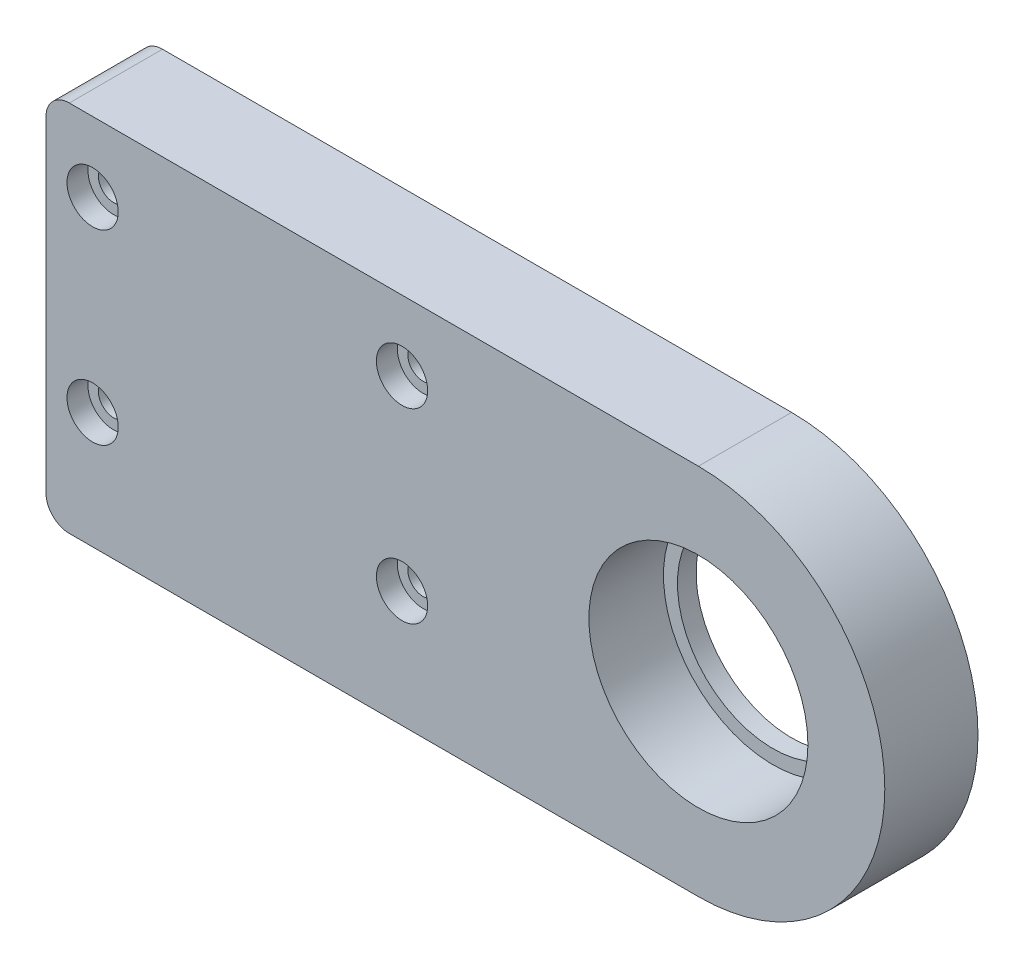
ISO-10303-21;
HEADER;
FILE_DESCRIPTION(('STEP AP214'),'2;1');
FILE_NAME('part.step','',(''),(''),'','','');
FILE_SCHEMA(('AUTOMOTIVE_DESIGN { 1 0 10303 214 1 1 1 1 }'));
ENDSEC;
DATA;
#1=APPLICATION_CONTEXT('core data for automotive mechanical design processes');
#2=APPLICATION_PROTOCOL_DEFINITION('international standard','automotive_design',2000,#1);
#3=PRODUCT_CONTEXT('',#1,'mechanical');
#4=PRODUCT('Part','Part','',(#3));
#5=PRODUCT_RELATED_PRODUCT_CATEGORY('part','',(#4));
#6=PRODUCT_DEFINITION_FORMATION('','',#4);
#7=PRODUCT_DEFINITION_CONTEXT('part definition',#1,'design');
#8=PRODUCT_DEFINITION('design','',#6,#7);
#9=PRODUCT_DEFINITION_SHAPE('','',#8);
#10=(LENGTH_UNIT() NAMED_UNIT(*) SI_UNIT(.MILLI.,.METRE.));
#11=(NAMED_UNIT(*) PLANE_ANGLE_UNIT() SI_UNIT($,.RADIAN.));
#12=(NAMED_UNIT(*) SI_UNIT($,.STERADIAN.) SOLID_ANGLE_UNIT());
#13=UNCERTAINTY_MEASURE_WITH_UNIT(LENGTH_MEASURE(1.E-05),#10,'distance_accuracy_value','');
#14=(GEOMETRIC_REPRESENTATION_CONTEXT(3) GLOBAL_UNCERTAINTY_ASSIGNED_CONTEXT((#13)) GLOBAL_UNIT_ASSIGNED_CONTEXT((#10,
#11,#12)) REPRESENTATION_CONTEXT('',''));
#15=CARTESIAN_POINT('',(0.,0.,0.));
#16=DIRECTION('',(0.,0.,1.));
#17=DIRECTION('',(1.,0.,0.));
#18=AXIS2_PLACEMENT_3D('',#15,#16,#17);
#19=CARTESIAN_POINT('',(-63.6,25.,-3.));
#20=DIRECTION('',(0.,0.,1.));
#21=DIRECTION('',(1.,0.,0.));
#22=AXIS2_PLACEMENT_3D('',#19,#20,#21);
#23=CYLINDRICAL_SURFACE('',#22,3.25000000000001);
#24=CARTESIAN_POINT('',(-63.6,25.,-3.));
#25=DIRECTION('',(0.,0.,1.));
#26=DIRECTION('',(1.,0.,0.));
#27=AXIS2_PLACEMENT_3D('',#24,#25,#26);
#28=CIRCLE('',#27,3.25000000000001);
#29=CARTESIAN_POINT('',(-60.35,25.,-3.));
#30=VERTEX_POINT('',#29);
#31=EDGE_CURVE('E589',#30,#30,#28,.T.);
#32=ORIENTED_EDGE('',*,*,#31,.F.);
#33=EDGE_LOOP('',(#32));
#34=FACE_BOUND('',#33,.T.);
#35=CARTESIAN_POINT('',(-63.6,25.,15.5));
#36=DIRECTION('',(0.,0.,1.));
#37=DIRECTION('',(1.,0.,0.));
#38=AXIS2_PLACEMENT_3D('',#35,#36,#37);
#39=CIRCLE('',#38,3.25000000000001);
#40=CARTESIAN_POINT('',(-60.35,25.,15.5));
#41=VERTEX_POINT('',#40);
#42=EDGE_CURVE('E246',#41,#41,#39,.F.);
#43=ORIENTED_EDGE('',*,*,#42,.F.);
#44=EDGE_LOOP('',(#43));
#45=FACE_BOUND('',#44,.T.);
#46=ADVANCED_FACE('F34',(#34,#45),#23,.F.);
#47=CARTESIAN_POINT('',(-130.,25.,-3.));
#48=DIRECTION('',(0.,0.,1.));
#49=DIRECTION('',(1.,0.,0.));
#50=AXIS2_PLACEMENT_3D('',#47,#48,#49);
#51=CYLINDRICAL_SURFACE('',#50,3.25000000000001);
#52=CARTESIAN_POINT('',(-130.,25.,-3.));
#53=DIRECTION('',(0.,0.,1.));
#54=DIRECTION('',(1.,0.,0.));
#55=AXIS2_PLACEMENT_3D('',#52,#53,#54);
#56=CIRCLE('',#55,3.25000000000001);
#57=CARTESIAN_POINT('',(-126.75,25.,-3.));
#58=VERTEX_POINT('',#57);
#59=EDGE_CURVE('E585',#58,#58,#56,.T.);
#60=ORIENTED_EDGE('',*,*,#59,.F.);
#61=EDGE_LOOP('',(#60));
#62=FACE_BOUND('',#61,.T.);
#63=CARTESIAN_POINT('',(-130.,25.,15.5));
#64=DIRECTION('',(0.,0.,1.));
#65=DIRECTION('',(1.,0.,0.));
#66=AXIS2_PLACEMENT_3D('',#63,#64,#65);
#67=CIRCLE('',#66,3.25000000000001);
#68=CARTESIAN_POINT('',(-126.75,25.,15.5));
#69=VERTEX_POINT('',#68);
#70=EDGE_CURVE('E243',#69,#69,#67,.F.);
#71=ORIENTED_EDGE('',*,*,#70,.F.);
#72=EDGE_LOOP('',(#71));
#73=FACE_BOUND('',#72,.T.);
#74=ADVANCED_FACE('F285',(#62,#73),#51,.F.);
#75=CARTESIAN_POINT('',(-130.,-15.,-3.));
#76=DIRECTION('',(0.,0.,1.));
#77=DIRECTION('',(1.,0.,0.));
#78=AXIS2_PLACEMENT_3D('',#75,#76,#77);
#79=CYLINDRICAL_SURFACE('',#78,3.25000000000001);
#80=CARTESIAN_POINT('',(-130.,-15.,-3.));
#81=DIRECTION('',(0.,0.,1.));
#82=DIRECTION('',(1.,0.,0.));
#83=AXIS2_PLACEMENT_3D('',#80,#81,#82);
#84=CIRCLE('',#83,3.25000000000001);
#85=CARTESIAN_POINT('',(-126.75,-15.,-3.));
#86=VERTEX_POINT('',#85);
#87=EDGE_CURVE('E582',#86,#86,#84,.T.);
#88=ORIENTED_EDGE('',*,*,#87,.F.);
#89=EDGE_LOOP('',(#88));
#90=FACE_BOUND('',#89,.T.);
#91=CARTESIAN_POINT('',(-130.,-15.,15.5));
#92=DIRECTION('',(0.,0.,1.));
#93=DIRECTION('',(1.,0.,0.));
#94=AXIS2_PLACEMENT_3D('',#91,#92,#93);
#95=CIRCLE('',#94,3.25000000000001);
#96=CARTESIAN_POINT('',(-126.75,-15.,15.5));
#97=VERTEX_POINT('',#96);
#98=EDGE_CURVE('E239',#97,#97,#95,.F.);
#99=ORIENTED_EDGE('',*,*,#98,.F.);
#100=EDGE_LOOP('',(#99));
#101=FACE_BOUND('',#100,.T.);
#102=ADVANCED_FACE('F291',(#90,#101),#79,.F.);
#103=CARTESIAN_POINT('',(-63.6,-15.,-3.));
#104=DIRECTION('',(0.,0.,1.));
#105=DIRECTION('',(1.,0.,0.));
#106=AXIS2_PLACEMENT_3D('',#103,#104,#105);
#107=CYLINDRICAL_SURFACE('',#106,3.25000000000001);
#108=CARTESIAN_POINT('',(-63.6,-15.,-3.));
#109=DIRECTION('',(0.,0.,1.));
#110=DIRECTION('',(1.,0.,0.));
#111=AXIS2_PLACEMENT_3D('',#108,#109,#110);
#112=CIRCLE('',#111,3.25000000000001);
#113=CARTESIAN_POINT('',(-60.35,-15.,-3.));
#114=VERTEX_POINT('',#113);
#115=EDGE_CURVE('E249',#114,#114,#112,.T.);
#116=ORIENTED_EDGE('',*,*,#115,.F.);
#117=EDGE_LOOP('',(#116));
#118=FACE_BOUND('',#117,.T.);
#119=CARTESIAN_POINT('',(-63.6,-15.,15.5));
#120=DIRECTION('',(0.,0.,1.));
#121=DIRECTION('',(1.,0.,0.));
#122=AXIS2_PLACEMENT_3D('',#119,#120,#121);
#123=CIRCLE('',#122,3.25000000000001);
#124=CARTESIAN_POINT('',(-60.35,-15.,15.5));
#125=VERTEX_POINT('',#124);
#126=EDGE_CURVE('E236',#125,#125,#123,.F.);
#127=ORIENTED_EDGE('',*,*,#126,.F.);
#128=EDGE_LOOP('',(#127));
#129=FACE_BOUND('',#128,.T.);
#130=ADVANCED_FACE('F298',(#118,#129),#107,.F.);
#131=CARTESIAN_POINT('',(0.,0.,0.));
#132=DIRECTION('',(0.,0.,1.));
#133=DIRECTION('',(1.,0.,0.));
#134=AXIS2_PLACEMENT_3D('',#131,#132,#133);
#135=PLANE('',#134);
#136=CARTESIAN_POINT('',(0.,0.,0.));
#137=DIRECTION('',(0.,0.,1.));
#138=DIRECTION('',(1.,0.,0.));
#139=AXIS2_PLACEMENT_3D('',#136,#137,#138);
#140=CIRCLE('',#139,20.5);
#141=CARTESIAN_POINT('',(20.5,0.,0.));
#142=VERTEX_POINT('',#141);
#143=EDGE_CURVE('E205',#142,#142,#140,.T.);
#144=ORIENTED_EDGE('',*,*,#143,.T.);
#145=EDGE_LOOP('',(#144));
#146=FACE_BOUND('',#145,.T.);
#147=DIRECTION('',(0.,-1.,0.));
#148=VECTOR('',#147,1.);
#149=CARTESIAN_POINT('',(-140.,40.,0.));
#150=LINE('',#149,#148);
#151=CARTESIAN_POINT('',(-140.,35.,0.));
#152=VERTEX_POINT('',#151);
#153=CARTESIAN_POINT('',(-140.,29.,0.));
#154=VERTEX_POINT('',#153);
#155=EDGE_CURVE('E162',#152,#154,#150,.T.);
#156=ORIENTED_EDGE('',*,*,#155,.F.);
#157=CARTESIAN_POINT('',(-135.,35.,0.));
#158=DIRECTION('',(0.,0.,1.));
#159=DIRECTION('',(1.,0.,0.));
#160=AXIS2_PLACEMENT_3D('',#157,#158,#159);
#161=CIRCLE('',#160,5.);
#162=CARTESIAN_POINT('',(-135.,40.,0.));
#163=VERTEX_POINT('',#162);
#164=EDGE_CURVE('E255',#152,#163,#161,.F.);
#165=ORIENTED_EDGE('',*,*,#164,.T.);
#166=DIRECTION('',(-1.,0.,0.));
#167=VECTOR('',#166,1.);
#168=CARTESIAN_POINT('',(0.,40.,0.));
#169=LINE('',#168,#167);
#170=CARTESIAN_POINT('',(0.,40.,0.));
#171=VERTEX_POINT('',#170);
#172=EDGE_CURVE('E222',#171,#163,#169,.T.);
#173=ORIENTED_EDGE('',*,*,#172,.F.);
#174=CARTESIAN_POINT('',(0.,0.,0.));
#175=DIRECTION('',(0.,0.,1.));
#176=DIRECTION('',(1.,0.,0.));
#177=AXIS2_PLACEMENT_3D('',#174,#175,#176);
#178=CIRCLE('',#177,40.);
#179=CARTESIAN_POINT('',(0.,-40.,0.));
#180=VERTEX_POINT('',#179);
#181=EDGE_CURVE('E208',#180,#171,#178,.T.);
#182=ORIENTED_EDGE('',*,*,#181,.F.);
#183=DIRECTION('',(1.,0.,0.));
#184=VECTOR('',#183,1.);
#185=CARTESIAN_POINT('',(-140.,-40.,0.));
#186=LINE('',#185,#184);
#187=CARTESIAN_POINT('',(-135.,-40.,0.));
#188=VERTEX_POINT('',#187);
#189=EDGE_CURVE('E213',#188,#180,#186,.T.);
#190=ORIENTED_EDGE('',*,*,#189,.F.);
#191=CARTESIAN_POINT('',(-135.,-35.,0.));
#192=DIRECTION('',(0.,0.,1.));
#193=DIRECTION('',(1.,0.,0.));
#194=AXIS2_PLACEMENT_3D('',#191,#192,#193);
#195=CIRCLE('',#194,5.);
#196=CARTESIAN_POINT('',(-140.,-35.,0.));
#197=VERTEX_POINT('',#196);
#198=EDGE_CURVE('E253',#188,#197,#195,.F.);
#199=ORIENTED_EDGE('',*,*,#198,.T.);
#200=CARTESIAN_POINT('',(-140.,-19.,0.));
#201=VERTEX_POINT('',#200);
#202=EDGE_CURVE('E224',#201,#197,#150,.T.);
#203=ORIENTED_EDGE('',*,*,#202,.F.);
#204=DIRECTION('',(-1.,0.,0.));
#205=VECTOR('',#204,1.);
#206=CARTESIAN_POINT('',(-140.,-19.,0.));
#207=LINE('',#206,#205);
#208=CARTESIAN_POINT('',(-55.,-19.,0.));
#209=VERTEX_POINT('',#208);
#210=EDGE_CURVE('E176',#209,#201,#207,.T.);
#211=ORIENTED_EDGE('',*,*,#210,.F.);
#212=DIRECTION('',(0.,-1.,0.));
#213=VECTOR('',#212,1.);
#214=CARTESIAN_POINT('',(-55.,-19.,0.));
#215=LINE('',#214,#213);
#216=CARTESIAN_POINT('',(-55.,-11.,0.));
#217=VERTEX_POINT('',#216);
#218=EDGE_CURVE('E166',#217,#209,#215,.T.);
#219=ORIENTED_EDGE('',*,*,#218,.F.);
#220=DIRECTION('',(1.,0.,0.));
#221=VECTOR('',#220,1.);
#222=CARTESIAN_POINT('',(-140.,-11.,0.));
#223=LINE('',#222,#221);
#224=CARTESIAN_POINT('',(-140.,-11.,0.));
#225=VERTEX_POINT('',#224);
#226=EDGE_CURVE('E163',#225,#217,#223,.T.);
#227=ORIENTED_EDGE('',*,*,#226,.F.);
#228=CARTESIAN_POINT('',(-140.,21.,0.));
#229=VERTEX_POINT('',#228);
#230=EDGE_CURVE('E226',#229,#225,#150,.T.);
#231=ORIENTED_EDGE('',*,*,#230,.F.);
#232=DIRECTION('',(-1.,0.,0.));
#233=VECTOR('',#232,1.);
#234=CARTESIAN_POINT('',(-140.,21.,0.));
#235=LINE('',#234,#233);
#236=CARTESIAN_POINT('',(-55.,21.,0.));
#237=VERTEX_POINT('',#236);
#238=EDGE_CURVE('E156',#237,#229,#235,.T.);
#239=ORIENTED_EDGE('',*,*,#238,.F.);
#240=DIRECTION('',(0.,-1.,0.));
#241=VECTOR('',#240,1.);
#242=CARTESIAN_POINT('',(-55.,21.,0.));
#243=LINE('',#242,#241);
#244=CARTESIAN_POINT('',(-55.,29.,0.));
#245=VERTEX_POINT('',#244);
#246=EDGE_CURVE('E597',#245,#237,#243,.T.);
#247=ORIENTED_EDGE('',*,*,#246,.F.);
#248=DIRECTION('',(1.,0.,0.));
#249=VECTOR('',#248,1.);
#250=CARTESIAN_POINT('',(-140.,29.,0.));
#251=LINE('',#250,#249);
#252=EDGE_CURVE('E591',#154,#245,#251,.T.);
#253=ORIENTED_EDGE('',*,*,#252,.F.);
#254=EDGE_LOOP('',(#156,#165,#173,#182,#190,#199,#203,#211,#219,#227,#231,#239,#247,#253));
#255=FACE_BOUND('',#254,.T.);
#256=ADVANCED_FACE('F266',(#146,#255),#135,.F.);
#257=CARTESIAN_POINT('',(0.,0.,20.));
#258=DIRECTION('',(0.,0.,-1.));
#259=DIRECTION('',(-1.,0.,0.));
#260=AXIS2_PLACEMENT_3D('',#257,#258,#259);
#261=CYLINDRICAL_SURFACE('',#260,20.5);
#262=ORIENTED_EDGE('',*,*,#143,.F.);
#263=EDGE_LOOP('',(#262));
#264=FACE_BOUND('',#263,.T.);
#265=CARTESIAN_POINT('',(0.,0.,4.));
#266=DIRECTION('',(0.,0.,1.));
#267=DIRECTION('',(1.,0.,0.));
#268=AXIS2_PLACEMENT_3D('',#265,#266,#267);
#269=CIRCLE('',#268,20.5);
#270=CARTESIAN_POINT('',(20.5,0.,4.));
#271=VERTEX_POINT('',#270);
#272=EDGE_CURVE('E202',#271,#271,#269,.T.);
#273=ORIENTED_EDGE('',*,*,#272,.T.);
#274=EDGE_LOOP('',(#273));
#275=FACE_BOUND('',#274,.T.);
#276=ADVANCED_FACE('F338',(#264,#275),#261,.F.);
#277=CARTESIAN_POINT('',(0.,0.,20.));
#278=DIRECTION('',(0.,0.,1.));
#279=DIRECTION('',(1.,0.,0.));
#280=AXIS2_PLACEMENT_3D('',#277,#278,#279);
#281=PLANE('',#280);
#282=CARTESIAN_POINT('',(-130.,-15.,20.));
#283=DIRECTION('',(0.,0.,1.));
#284=DIRECTION('',(1.,0.,0.));
#285=AXIS2_PLACEMENT_3D('',#282,#283,#284);
#286=CIRCLE('',#285,5.5);
#287=CARTESIAN_POINT('',(-124.5,-15.,20.));
#288=VERTEX_POINT('',#287);
#289=EDGE_CURVE('E625',#288,#288,#286,.T.);
#290=ORIENTED_EDGE('',*,*,#289,.F.);
#291=EDGE_LOOP('',(#290));
#292=FACE_BOUND('',#291,.T.);
#293=CARTESIAN_POINT('',(-63.6,-15.,20.));
#294=DIRECTION('',(0.,0.,1.));
#295=DIRECTION('',(1.,0.,0.));
#296=AXIS2_PLACEMENT_3D('',#293,#294,#295);
#297=CIRCLE('',#296,5.49999999999999);
#298=CARTESIAN_POINT('',(-58.1,-15.,20.));
#299=VERTEX_POINT('',#298);
#300=EDGE_CURVE('E631',#299,#299,#297,.T.);
#301=ORIENTED_EDGE('',*,*,#300,.F.);
#302=EDGE_LOOP('',(#301));
#303=FACE_BOUND('',#302,.T.);
#304=CARTESIAN_POINT('',(-63.6,25.,20.));
#305=DIRECTION('',(0.,0.,1.));
#306=DIRECTION('',(1.,0.,0.));
#307=AXIS2_PLACEMENT_3D('',#304,#305,#306);
#308=CIRCLE('',#307,5.49999999999999);
#309=CARTESIAN_POINT('',(-58.1,25.,20.));
#310=VERTEX_POINT('',#309);
#311=EDGE_CURVE('E637',#310,#310,#308,.T.);
#312=ORIENTED_EDGE('',*,*,#311,.F.);
#313=EDGE_LOOP('',(#312));
#314=FACE_BOUND('',#313,.T.);
#315=CARTESIAN_POINT('',(-130.,25.,20.));
#316=DIRECTION('',(0.,0.,1.));
#317=DIRECTION('',(1.,0.,0.));
#318=AXIS2_PLACEMENT_3D('',#315,#316,#317);
#319=CIRCLE('',#318,5.5);
#320=CARTESIAN_POINT('',(-124.5,25.,20.));
#321=VERTEX_POINT('',#320);
#322=EDGE_CURVE('E619',#321,#321,#319,.T.);
#323=ORIENTED_EDGE('',*,*,#322,.F.);
#324=EDGE_LOOP('',(#323));
#325=FACE_BOUND('',#324,.T.);
#326=CARTESIAN_POINT('',(0.,0.,20.));
#327=DIRECTION('',(0.,0.,1.));
#328=DIRECTION('',(1.,0.,0.));
#329=AXIS2_PLACEMENT_3D('',#326,#327,#328);
#330=CIRCLE('',#329,23.5);
#331=CARTESIAN_POINT('',(23.5,0.,20.));
#332=VERTEX_POINT('',#331);
#333=EDGE_CURVE('E198',#332,#332,#330,.T.);
#334=ORIENTED_EDGE('',*,*,#333,.F.);
#335=EDGE_LOOP('',(#334));
#336=FACE_BOUND('',#335,.T.);
#337=DIRECTION('',(-1.,0.,0.));
#338=VECTOR('',#337,1.);
#339=CARTESIAN_POINT('',(0.,40.,20.));
#340=LINE('',#339,#338);
#341=CARTESIAN_POINT('',(0.,40.,20.));
#342=VERTEX_POINT('',#341);
#343=CARTESIAN_POINT('',(-135.,40.,20.));
#344=VERTEX_POINT('',#343);
#345=EDGE_CURVE('E212',#342,#344,#340,.T.);
#346=ORIENTED_EDGE('',*,*,#345,.T.);
#347=CARTESIAN_POINT('',(-135.,35.,20.));
#348=DIRECTION('',(0.,0.,1.));
#349=DIRECTION('',(1.,0.,0.));
#350=AXIS2_PLACEMENT_3D('',#347,#348,#349);
#351=CIRCLE('',#350,5.);
#352=CARTESIAN_POINT('',(-140.,35.,20.));
#353=VERTEX_POINT('',#352);
#354=EDGE_CURVE('E42',#344,#353,#351,.T.);
#355=ORIENTED_EDGE('',*,*,#354,.T.);
#356=DIRECTION('',(0.,-1.,0.));
#357=VECTOR('',#356,1.);
#358=CARTESIAN_POINT('',(-140.,40.,20.));
#359=LINE('',#358,#357);
#360=CARTESIAN_POINT('',(-140.,-35.,20.));
#361=VERTEX_POINT('',#360);
#362=EDGE_CURVE('E215',#353,#361,#359,.T.);
#363=ORIENTED_EDGE('',*,*,#362,.T.);
#364=CARTESIAN_POINT('',(-135.,-35.,20.));
#365=DIRECTION('',(0.,0.,1.));
#366=DIRECTION('',(1.,0.,0.));
#367=AXIS2_PLACEMENT_3D('',#364,#365,#366);
#368=CIRCLE('',#367,5.);
#369=CARTESIAN_POINT('',(-135.,-40.,20.));
#370=VERTEX_POINT('',#369);
#371=EDGE_CURVE('E49',#361,#370,#368,.T.);
#372=ORIENTED_EDGE('',*,*,#371,.T.);
#373=DIRECTION('',(1.,0.,0.));
#374=VECTOR('',#373,1.);
#375=CARTESIAN_POINT('',(-140.,-40.,20.));
#376=LINE('',#375,#374);
#377=CARTESIAN_POINT('',(0.,-40.,20.));
#378=VERTEX_POINT('',#377);
#379=EDGE_CURVE('E217',#370,#378,#376,.T.);
#380=ORIENTED_EDGE('',*,*,#379,.T.);
#381=CARTESIAN_POINT('',(0.,0.,20.));
#382=DIRECTION('',(0.,0.,1.));
#383=DIRECTION('',(1.,0.,0.));
#384=AXIS2_PLACEMENT_3D('',#381,#382,#383);
#385=CIRCLE('',#384,40.);
#386=EDGE_CURVE('E209',#378,#342,#385,.T.);
#387=ORIENTED_EDGE('',*,*,#386,.T.);
#388=EDGE_LOOP('',(#346,#355,#363,#372,#380,#387));
#389=FACE_BOUND('',#388,.T.);
#390=ADVANCED_FACE('F259',(#292,#303,#314,#325,#336,#389),#281,.T.);
#391=CARTESIAN_POINT('',(0.,0.,20.));
#392=DIRECTION('',(0.,0.,-1.));
#393=DIRECTION('',(-1.,0.,0.));
#394=AXIS2_PLACEMENT_3D('',#391,#392,#393);
#395=CYLINDRICAL_SURFACE('',#394,40.);
#396=ORIENTED_EDGE('',*,*,#181,.T.);
#397=DIRECTION('',(0.,0.,-1.));
#398=VECTOR('',#397,1.);
#399=CARTESIAN_POINT('',(0.,40.,20.));
#400=LINE('',#399,#398);
#401=EDGE_CURVE('E230',#342,#171,#400,.T.);
#402=ORIENTED_EDGE('',*,*,#401,.F.);
#403=ORIENTED_EDGE('',*,*,#386,.F.);
#404=DIRECTION('',(0.,0.,-1.));
#405=VECTOR('',#404,1.);
#406=CARTESIAN_POINT('',(0.,-40.,20.));
#407=LINE('',#406,#405);
#408=EDGE_CURVE('E219',#378,#180,#407,.T.);
#409=ORIENTED_EDGE('',*,*,#408,.T.);
#410=EDGE_LOOP('',(#396,#402,#403,#409));
#411=FACE_BOUND('',#410,.T.);
#412=ADVANCED_FACE('F272',(#411),#395,.T.);
#413=CARTESIAN_POINT('',(0.,40.,20.));
#414=DIRECTION('',(0.,-1.,0.));
#415=DIRECTION('',(0.,0.,-1.));
#416=AXIS2_PLACEMENT_3D('',#413,#414,#415);
#417=PLANE('',#416);
#418=ORIENTED_EDGE('',*,*,#172,.T.);
#419=DIRECTION('',(0.,0.,-1.));
#420=VECTOR('',#419,1.);
#421=CARTESIAN_POINT('',(-135.,40.,20.));
#422=LINE('',#421,#420);
#423=EDGE_CURVE('E57',#163,#344,#422,.F.);
#424=ORIENTED_EDGE('',*,*,#423,.T.);
#425=ORIENTED_EDGE('',*,*,#345,.F.);
#426=ORIENTED_EDGE('',*,*,#401,.T.);
#427=EDGE_LOOP('',(#418,#424,#425,#426));
#428=FACE_BOUND('',#427,.T.);
#429=ADVANCED_FACE('F268',(#428),#417,.F.);
#430=CARTESIAN_POINT('',(-140.,40.,20.));
#431=DIRECTION('',(1.,0.,0.));
#432=DIRECTION('',(0.,0.,-1.));
#433=AXIS2_PLACEMENT_3D('',#430,#431,#432);
#434=PLANE('',#433);
#435=ORIENTED_EDGE('',*,*,#362,.F.);
#436=DIRECTION('',(0.,0.,-1.));
#437=VECTOR('',#436,1.);
#438=CARTESIAN_POINT('',(-140.,35.,20.));
#439=LINE('',#438,#437);
#440=EDGE_CURVE('E251',#353,#152,#439,.T.);
#441=ORIENTED_EDGE('',*,*,#440,.T.);
#442=ORIENTED_EDGE('',*,*,#155,.T.);
#443=DIRECTION('',(0.,0.,1.));
#444=VECTOR('',#443,1.);
#445=CARTESIAN_POINT('',(-140.,29.,-3.));
#446=LINE('',#445,#444);
#447=CARTESIAN_POINT('',(-140.,29.,-3.));
#448=VERTEX_POINT('',#447);
#449=EDGE_CURVE('E141',#448,#154,#446,.T.);
#450=ORIENTED_EDGE('',*,*,#449,.F.);
#451=DIRECTION('',(0.,1.,0.));
#452=VECTOR('',#451,1.);
#453=CARTESIAN_POINT('',(-140.,21.,-3.));
#454=LINE('',#453,#452);
#455=CARTESIAN_POINT('',(-140.,21.,-3.));
#456=VERTEX_POINT('',#455);
#457=EDGE_CURVE('E148',#456,#448,#454,.T.);
#458=ORIENTED_EDGE('',*,*,#457,.F.);
#459=DIRECTION('',(0.,0.,1.));
#460=VECTOR('',#459,1.);
#461=CARTESIAN_POINT('',(-140.,21.,-3.));
#462=LINE('',#461,#460);
#463=EDGE_CURVE('E595',#456,#229,#462,.T.);
#464=ORIENTED_EDGE('',*,*,#463,.T.);
#465=ORIENTED_EDGE('',*,*,#230,.T.);
#466=DIRECTION('',(0.,0.,1.));
#467=VECTOR('',#466,1.);
#468=CARTESIAN_POINT('',(-140.,-11.,-3.));
#469=LINE('',#468,#467);
#470=CARTESIAN_POINT('',(-140.,-11.,-3.));
#471=VERTEX_POINT('',#470);
#472=EDGE_CURVE('E195',#471,#225,#469,.T.);
#473=ORIENTED_EDGE('',*,*,#472,.F.);
#474=DIRECTION('',(0.,1.,0.));
#475=VECTOR('',#474,1.);
#476=CARTESIAN_POINT('',(-140.,-19.,-3.));
#477=LINE('',#476,#475);
#478=CARTESIAN_POINT('',(-140.,-19.,-3.));
#479=VERTEX_POINT('',#478);
#480=EDGE_CURVE('E172',#479,#471,#477,.T.);
#481=ORIENTED_EDGE('',*,*,#480,.F.);
#482=DIRECTION('',(0.,0.,1.));
#483=VECTOR('',#482,1.);
#484=CARTESIAN_POINT('',(-140.,-19.,-3.));
#485=LINE('',#484,#483);
#486=EDGE_CURVE('E181',#479,#201,#485,.T.);
#487=ORIENTED_EDGE('',*,*,#486,.T.);
#488=ORIENTED_EDGE('',*,*,#202,.T.);
#489=DIRECTION('',(0.,0.,-1.));
#490=VECTOR('',#489,1.);
#491=CARTESIAN_POINT('',(-140.,-35.,20.));
#492=LINE('',#491,#490);
#493=EDGE_CURVE('E233',#197,#361,#492,.F.);
#494=ORIENTED_EDGE('',*,*,#493,.T.);
#495=EDGE_LOOP('',(#435,#441,#442,#450,#458,#464,#465,#473,#481,#487,#488,#494));
#496=FACE_BOUND('',#495,.T.);
#497=ADVANCED_FACE('F159',(#496),#434,.F.);
#498=CARTESIAN_POINT('',(-140.,-40.,20.));
#499=DIRECTION('',(0.,1.,0.));
#500=DIRECTION('',(0.,0.,1.));
#501=AXIS2_PLACEMENT_3D('',#498,#499,#500);
#502=PLANE('',#501);
#503=ORIENTED_EDGE('',*,*,#379,.F.);
#504=DIRECTION('',(0.,0.,-1.));
#505=VECTOR('',#504,1.);
#506=CARTESIAN_POINT('',(-135.,-40.,20.));
#507=LINE('',#506,#505);
#508=EDGE_CURVE('E11',#370,#188,#507,.T.);
#509=ORIENTED_EDGE('',*,*,#508,.T.);
#510=ORIENTED_EDGE('',*,*,#189,.T.);
#511=ORIENTED_EDGE('',*,*,#408,.F.);
#512=EDGE_LOOP('',(#503,#509,#510,#511));
#513=FACE_BOUND('',#512,.T.);
#514=ADVANCED_FACE('F276',(#513),#502,.F.);
#515=CARTESIAN_POINT('',(0.,0.,4.));
#516=DIRECTION('',(0.,0.,1.));
#517=DIRECTION('',(1.,0.,0.));
#518=AXIS2_PLACEMENT_3D('',#515,#516,#517);
#519=CYLINDRICAL_SURFACE('',#518,23.5);
#520=CARTESIAN_POINT('',(0.,0.,4.));
#521=DIRECTION('',(0.,0.,1.));
#522=DIRECTION('',(1.,0.,0.));
#523=AXIS2_PLACEMENT_3D('',#520,#521,#522);
#524=CIRCLE('',#523,23.5);
#525=CARTESIAN_POINT('',(23.5,0.,4.));
#526=VERTEX_POINT('',#525);
#527=EDGE_CURVE('E199',#526,#526,#524,.T.);
#528=ORIENTED_EDGE('',*,*,#527,.F.);
#529=EDGE_LOOP('',(#528));
#530=FACE_BOUND('',#529,.T.);
#531=ORIENTED_EDGE('',*,*,#333,.T.);
#532=EDGE_LOOP('',(#531));
#533=FACE_BOUND('',#532,.T.);
#534=ADVANCED_FACE('F333',(#530,#533),#519,.F.);
#535=CARTESIAN_POINT('',(0.,0.,4.));
#536=DIRECTION('',(0.,0.,1.));
#537=DIRECTION('',(1.,0.,0.));
#538=AXIS2_PLACEMENT_3D('',#535,#536,#537);
#539=PLANE('',#538);
#540=ORIENTED_EDGE('',*,*,#272,.F.);
#541=EDGE_LOOP('',(#540));
#542=FACE_BOUND('',#541,.T.);
#543=ORIENTED_EDGE('',*,*,#527,.T.);
#544=EDGE_LOOP('',(#543));
#545=FACE_BOUND('',#544,.T.);
#546=ADVANCED_FACE('F329',(#542,#545),#539,.T.);
#547=CARTESIAN_POINT('',(-140.,-11.,-3.));
#548=DIRECTION('',(0.,-1.,0.));
#549=DIRECTION('',(0.,0.,-1.));
#550=AXIS2_PLACEMENT_3D('',#547,#548,#549);
#551=PLANE('',#550);
#552=ORIENTED_EDGE('',*,*,#226,.T.);
#553=DIRECTION('',(0.,0.,1.));
#554=VECTOR('',#553,1.);
#555=CARTESIAN_POINT('',(-55.,-11.,-3.));
#556=LINE('',#555,#554);
#557=CARTESIAN_POINT('',(-55.,-11.,-3.));
#558=VERTEX_POINT('',#557);
#559=EDGE_CURVE('E192',#558,#217,#556,.T.);
#560=ORIENTED_EDGE('',*,*,#559,.F.);
#561=DIRECTION('',(1.,0.,0.));
#562=VECTOR('',#561,1.);
#563=CARTESIAN_POINT('',(-140.,-11.,-3.));
#564=LINE('',#563,#562);
#565=EDGE_CURVE('E175',#471,#558,#564,.T.);
#566=ORIENTED_EDGE('',*,*,#565,.F.);
#567=ORIENTED_EDGE('',*,*,#472,.T.);
#568=EDGE_LOOP('',(#552,#560,#566,#567));
#569=FACE_BOUND('',#568,.T.);
#570=ADVANCED_FACE('F325',(#569),#551,.F.);
#571=CARTESIAN_POINT('',(-55.,-19.,-3.));
#572=DIRECTION('',(-1.,0.,0.));
#573=DIRECTION('',(0.,0.,1.));
#574=AXIS2_PLACEMENT_3D('',#571,#572,#573);
#575=PLANE('',#574);
#576=ORIENTED_EDGE('',*,*,#218,.T.);
#577=DIRECTION('',(0.,0.,1.));
#578=VECTOR('',#577,1.);
#579=CARTESIAN_POINT('',(-55.,-19.,-3.));
#580=LINE('',#579,#578);
#581=CARTESIAN_POINT('',(-55.,-19.,-3.));
#582=VERTEX_POINT('',#581);
#583=EDGE_CURVE('E189',#582,#209,#580,.T.);
#584=ORIENTED_EDGE('',*,*,#583,.F.);
#585=DIRECTION('',(0.,-1.,0.));
#586=VECTOR('',#585,1.);
#587=CARTESIAN_POINT('',(-55.,-19.,-3.));
#588=LINE('',#587,#586);
#589=EDGE_CURVE('E178',#558,#582,#588,.T.);
#590=ORIENTED_EDGE('',*,*,#589,.F.);
#591=ORIENTED_EDGE('',*,*,#559,.T.);
#592=EDGE_LOOP('',(#576,#584,#590,#591));
#593=FACE_BOUND('',#592,.T.);
#594=ADVANCED_FACE('F321',(#593),#575,.F.);
#595=CARTESIAN_POINT('',(-140.,-19.,-3.));
#596=DIRECTION('',(0.,1.,0.));
#597=DIRECTION('',(-1.,0.,0.));
#598=AXIS2_PLACEMENT_3D('',#595,#596,#597);
#599=PLANE('',#598);
#600=ORIENTED_EDGE('',*,*,#210,.T.);
#601=ORIENTED_EDGE('',*,*,#486,.F.);
#602=DIRECTION('',(-1.,0.,0.));
#603=VECTOR('',#602,1.);
#604=CARTESIAN_POINT('',(-140.,-19.,-3.));
#605=LINE('',#604,#603);
#606=EDGE_CURVE('E180',#582,#479,#605,.T.);
#607=ORIENTED_EDGE('',*,*,#606,.F.);
#608=ORIENTED_EDGE('',*,*,#583,.T.);
#609=EDGE_LOOP('',(#600,#601,#607,#608));
#610=FACE_BOUND('',#609,.T.);
#611=ADVANCED_FACE('F317',(#610),#599,.F.);
#612=CARTESIAN_POINT('',(0.,0.,-3.));
#613=DIRECTION('',(0.,0.,-1.));
#614=DIRECTION('',(-1.,0.,0.));
#615=AXIS2_PLACEMENT_3D('',#612,#613,#614);
#616=PLANE('',#615);
#617=ORIENTED_EDGE('',*,*,#115,.T.);
#618=EDGE_LOOP('',(#617));
#619=FACE_BOUND('',#618,.T.);
#620=ORIENTED_EDGE('',*,*,#87,.T.);
#621=EDGE_LOOP('',(#620));
#622=FACE_BOUND('',#621,.T.);
#623=ORIENTED_EDGE('',*,*,#480,.T.);
#624=ORIENTED_EDGE('',*,*,#565,.T.);
#625=ORIENTED_EDGE('',*,*,#589,.T.);
#626=ORIENTED_EDGE('',*,*,#606,.T.);
#627=EDGE_LOOP('',(#623,#624,#625,#626));
#628=FACE_BOUND('',#627,.T.);
#629=ADVANCED_FACE('F314',(#619,#622,#628),#616,.T.);
#630=CARTESIAN_POINT('',(-140.,29.,-3.));
#631=DIRECTION('',(0.,-1.,0.));
#632=DIRECTION('',(1.,0.,0.));
#633=AXIS2_PLACEMENT_3D('',#630,#631,#632);
#634=PLANE('',#633);
#635=ORIENTED_EDGE('',*,*,#252,.T.);
#636=DIRECTION('',(0.,0.,1.));
#637=VECTOR('',#636,1.);
#638=CARTESIAN_POINT('',(-55.,29.,-3.));
#639=LINE('',#638,#637);
#640=CARTESIAN_POINT('',(-55.,29.,-3.));
#641=VERTEX_POINT('',#640);
#642=EDGE_CURVE('E144',#641,#245,#639,.T.);
#643=ORIENTED_EDGE('',*,*,#642,.F.);
#644=DIRECTION('',(1.,0.,0.));
#645=VECTOR('',#644,1.);
#646=CARTESIAN_POINT('',(-140.,29.,-3.));
#647=LINE('',#646,#645);
#648=EDGE_CURVE('E137',#448,#641,#647,.T.);
#649=ORIENTED_EDGE('',*,*,#648,.F.);
#650=ORIENTED_EDGE('',*,*,#449,.T.);
#651=EDGE_LOOP('',(#635,#643,#649,#650));
#652=FACE_BOUND('',#651,.T.);
#653=ADVANCED_FACE('F139',(#652),#634,.F.);
#654=CARTESIAN_POINT('',(-55.,21.,-3.));
#655=DIRECTION('',(-1.,0.,0.));
#656=DIRECTION('',(0.,0.,1.));
#657=AXIS2_PLACEMENT_3D('',#654,#655,#656);
#658=PLANE('',#657);
#659=ORIENTED_EDGE('',*,*,#246,.T.);
#660=DIRECTION('',(0.,0.,1.));
#661=VECTOR('',#660,1.);
#662=CARTESIAN_POINT('',(-55.,21.,-3.));
#663=LINE('',#662,#661);
#664=CARTESIAN_POINT('',(-55.,21.,-3.));
#665=VERTEX_POINT('',#664);
#666=EDGE_CURVE('E168',#665,#237,#663,.T.);
#667=ORIENTED_EDGE('',*,*,#666,.F.);
#668=DIRECTION('',(0.,-1.,0.));
#669=VECTOR('',#668,1.);
#670=CARTESIAN_POINT('',(-55.,21.,-3.));
#671=LINE('',#670,#669);
#672=EDGE_CURVE('E147',#641,#665,#671,.T.);
#673=ORIENTED_EDGE('',*,*,#672,.F.);
#674=ORIENTED_EDGE('',*,*,#642,.T.);
#675=EDGE_LOOP('',(#659,#667,#673,#674));
#676=FACE_BOUND('',#675,.T.);
#677=ADVANCED_FACE('F307',(#676),#658,.F.);
#678=CARTESIAN_POINT('',(-140.,21.,-3.));
#679=DIRECTION('',(0.,1.,0.));
#680=DIRECTION('',(-1.,0.,0.));
#681=AXIS2_PLACEMENT_3D('',#678,#679,#680);
#682=PLANE('',#681);
#683=ORIENTED_EDGE('',*,*,#238,.T.);
#684=ORIENTED_EDGE('',*,*,#463,.F.);
#685=DIRECTION('',(-1.,0.,0.));
#686=VECTOR('',#685,1.);
#687=CARTESIAN_POINT('',(-140.,21.,-3.));
#688=LINE('',#687,#686);
#689=EDGE_CURVE('E153',#665,#456,#688,.T.);
#690=ORIENTED_EDGE('',*,*,#689,.F.);
#691=ORIENTED_EDGE('',*,*,#666,.T.);
#692=EDGE_LOOP('',(#683,#684,#690,#691));
#693=FACE_BOUND('',#692,.T.);
#694=ADVANCED_FACE('F303',(#693),#682,.F.);
#695=CARTESIAN_POINT('',(0.,0.,-3.));
#696=DIRECTION('',(0.,0.,-1.));
#697=DIRECTION('',(-1.,0.,0.));
#698=AXIS2_PLACEMENT_3D('',#695,#696,#697);
#699=PLANE('',#698);
#700=ORIENTED_EDGE('',*,*,#59,.T.);
#701=EDGE_LOOP('',(#700));
#702=FACE_BOUND('',#701,.T.);
#703=ORIENTED_EDGE('',*,*,#31,.T.);
#704=EDGE_LOOP('',(#703));
#705=FACE_BOUND('',#704,.T.);
#706=ORIENTED_EDGE('',*,*,#457,.T.);
#707=ORIENTED_EDGE('',*,*,#648,.T.);
#708=ORIENTED_EDGE('',*,*,#672,.T.);
#709=ORIENTED_EDGE('',*,*,#689,.T.);
#710=EDGE_LOOP('',(#706,#707,#708,#709));
#711=FACE_BOUND('',#710,.T.);
#712=ADVANCED_FACE('F151',(#702,#705,#711),#699,.T.);
#713=CARTESIAN_POINT('',(-63.6,-15.,15.5));
#714=DIRECTION('',(0.,0.,1.));
#715=DIRECTION('',(1.,0.,0.));
#716=AXIS2_PLACEMENT_3D('',#713,#714,#715);
#717=PLANE('',#716);
#718=CARTESIAN_POINT('',(-63.6,-15.,15.5));
#719=DIRECTION('',(0.,0.,1.));
#720=DIRECTION('',(1.,0.,0.));
#721=AXIS2_PLACEMENT_3D('',#718,#719,#720);
#722=CIRCLE('',#721,5.49999999999999);
#723=CARTESIAN_POINT('',(-58.1,-15.,15.5));
#724=VERTEX_POINT('',#723);
#725=EDGE_CURVE('E634',#724,#724,#722,.T.);
#726=ORIENTED_EDGE('',*,*,#725,.T.);
#727=EDGE_LOOP('',(#726));
#728=FACE_BOUND('',#727,.T.);
#729=ORIENTED_EDGE('',*,*,#126,.T.);
#730=EDGE_LOOP('',(#729));
#731=FACE_BOUND('',#730,.T.);
#732=ADVANCED_FACE('F302',(#728,#731),#717,.T.);
#733=CARTESIAN_POINT('',(-63.6,-15.,15.5));
#734=DIRECTION('',(0.,0.,1.));
#735=DIRECTION('',(1.,0.,0.));
#736=AXIS2_PLACEMENT_3D('',#733,#734,#735);
#737=CYLINDRICAL_SURFACE('',#736,5.49999999999999);
#738=ORIENTED_EDGE('',*,*,#725,.F.);
#739=EDGE_LOOP('',(#738));
#740=FACE_BOUND('',#739,.T.);
#741=ORIENTED_EDGE('',*,*,#300,.T.);
#742=EDGE_LOOP('',(#741));
#743=FACE_BOUND('',#742,.T.);
#744=ADVANCED_FACE('F419',(#740,#743),#737,.F.);
#745=CARTESIAN_POINT('',(-130.,-15.,15.5));
#746=DIRECTION('',(0.,0.,1.));
#747=DIRECTION('',(1.,0.,0.));
#748=AXIS2_PLACEMENT_3D('',#745,#746,#747);
#749=PLANE('',#748);
#750=CARTESIAN_POINT('',(-130.,-15.,15.5));
#751=DIRECTION('',(0.,0.,1.));
#752=DIRECTION('',(1.,0.,0.));
#753=AXIS2_PLACEMENT_3D('',#750,#751,#752);
#754=CIRCLE('',#753,5.5);
#755=CARTESIAN_POINT('',(-124.5,-15.,15.5));
#756=VERTEX_POINT('',#755);
#757=EDGE_CURVE('E628',#756,#756,#754,.T.);
#758=ORIENTED_EDGE('',*,*,#757,.T.);
#759=EDGE_LOOP('',(#758));
#760=FACE_BOUND('',#759,.T.);
#761=ORIENTED_EDGE('',*,*,#98,.T.);
#762=EDGE_LOOP('',(#761));
#763=FACE_BOUND('',#762,.T.);
#764=ADVANCED_FACE('F428',(#760,#763),#749,.T.);
#765=CARTESIAN_POINT('',(-130.,-15.,15.5));
#766=DIRECTION('',(0.,0.,1.));
#767=DIRECTION('',(1.,0.,0.));
#768=AXIS2_PLACEMENT_3D('',#765,#766,#767);
#769=CYLINDRICAL_SURFACE('',#768,5.5);
#770=ORIENTED_EDGE('',*,*,#757,.F.);
#771=EDGE_LOOP('',(#770));
#772=FACE_BOUND('',#771,.T.);
#773=ORIENTED_EDGE('',*,*,#289,.T.);
#774=EDGE_LOOP('',(#773));
#775=FACE_BOUND('',#774,.T.);
#776=ADVANCED_FACE('F436',(#772,#775),#769,.F.);
#777=CARTESIAN_POINT('',(-130.,25.,15.5));
#778=DIRECTION('',(0.,0.,1.));
#779=DIRECTION('',(1.,0.,0.));
#780=AXIS2_PLACEMENT_3D('',#777,#778,#779);
#781=PLANE('',#780);
#782=CARTESIAN_POINT('',(-130.,25.,15.5));
#783=DIRECTION('',(0.,0.,1.));
#784=DIRECTION('',(1.,0.,0.));
#785=AXIS2_PLACEMENT_3D('',#782,#783,#784);
#786=CIRCLE('',#785,5.5);
#787=CARTESIAN_POINT('',(-124.5,25.,15.5));
#788=VERTEX_POINT('',#787);
#789=EDGE_CURVE('E240',#788,#788,#786,.T.);
#790=ORIENTED_EDGE('',*,*,#789,.T.);
#791=EDGE_LOOP('',(#790));
#792=FACE_BOUND('',#791,.T.);
#793=ORIENTED_EDGE('',*,*,#70,.T.);
#794=EDGE_LOOP('',(#793));
#795=FACE_BOUND('',#794,.T.);
#796=ADVANCED_FACE('F444',(#792,#795),#781,.T.);
#797=CARTESIAN_POINT('',(-130.,25.,15.5));
#798=DIRECTION('',(0.,0.,1.));
#799=DIRECTION('',(1.,0.,0.));
#800=AXIS2_PLACEMENT_3D('',#797,#798,#799);
#801=CYLINDRICAL_SURFACE('',#800,5.5);
#802=ORIENTED_EDGE('',*,*,#789,.F.);
#803=EDGE_LOOP('',(#802));
#804=FACE_BOUND('',#803,.T.);
#805=ORIENTED_EDGE('',*,*,#322,.T.);
#806=EDGE_LOOP('',(#805));
#807=FACE_BOUND('',#806,.T.);
#808=ADVANCED_FACE('F452',(#804,#807),#801,.F.);
#809=CARTESIAN_POINT('',(-63.6,25.,15.5));
#810=DIRECTION('',(0.,0.,1.));
#811=DIRECTION('',(1.,0.,0.));
#812=AXIS2_PLACEMENT_3D('',#809,#810,#811);
#813=PLANE('',#812);
#814=CARTESIAN_POINT('',(-63.6,25.,15.5));
#815=DIRECTION('',(0.,0.,1.));
#816=DIRECTION('',(1.,0.,0.));
#817=AXIS2_PLACEMENT_3D('',#814,#815,#816);
#818=CIRCLE('',#817,5.49999999999999);
#819=CARTESIAN_POINT('',(-58.1,25.,15.5));
#820=VERTEX_POINT('',#819);
#821=EDGE_CURVE('E622',#820,#820,#818,.T.);
#822=ORIENTED_EDGE('',*,*,#821,.T.);
#823=EDGE_LOOP('',(#822));
#824=FACE_BOUND('',#823,.T.);
#825=ORIENTED_EDGE('',*,*,#42,.T.);
#826=EDGE_LOOP('',(#825));
#827=FACE_BOUND('',#826,.T.);
#828=ADVANCED_FACE('F460',(#824,#827),#813,.T.);
#829=CARTESIAN_POINT('',(-63.6,25.,15.5));
#830=DIRECTION('',(0.,0.,1.));
#831=DIRECTION('',(1.,0.,0.));
#832=AXIS2_PLACEMENT_3D('',#829,#830,#831);
#833=CYLINDRICAL_SURFACE('',#832,5.49999999999999);
#834=ORIENTED_EDGE('',*,*,#821,.F.);
#835=EDGE_LOOP('',(#834));
#836=FACE_BOUND('',#835,.T.);
#837=ORIENTED_EDGE('',*,*,#311,.T.);
#838=EDGE_LOOP('',(#837));
#839=FACE_BOUND('',#838,.T.);
#840=ADVANCED_FACE('F283',(#836,#839),#833,.F.);
#841=CARTESIAN_POINT('',(-135.,35.,20.));
#842=DIRECTION('',(0.,0.,-1.));
#843=DIRECTION('',(-1.,0.,0.));
#844=AXIS2_PLACEMENT_3D('',#841,#842,#843);
#845=CYLINDRICAL_SURFACE('',#844,5.);
#846=ORIENTED_EDGE('',*,*,#354,.F.);
#847=ORIENTED_EDGE('',*,*,#423,.F.);
#848=ORIENTED_EDGE('',*,*,#164,.F.);
#849=ORIENTED_EDGE('',*,*,#440,.F.);
#850=EDGE_LOOP('',(#846,#847,#848,#849));
#851=FACE_BOUND('',#850,.T.);
#852=ADVANCED_FACE('F264',(#851),#845,.T.);
#853=CARTESIAN_POINT('',(-135.,-35.,20.));
#854=DIRECTION('',(0.,0.,-1.));
#855=DIRECTION('',(-1.,0.,0.));
#856=AXIS2_PLACEMENT_3D('',#853,#854,#855);
#857=CYLINDRICAL_SURFACE('',#856,5.);
#858=ORIENTED_EDGE('',*,*,#371,.F.);
#859=ORIENTED_EDGE('',*,*,#493,.F.);
#860=ORIENTED_EDGE('',*,*,#198,.F.);
#861=ORIENTED_EDGE('',*,*,#508,.F.);
#862=EDGE_LOOP('',(#858,#859,#860,#861));
#863=FACE_BOUND('',#862,.T.);
#864=ADVANCED_FACE('F36',(#863),#857,.T.);
#865=CLOSED_SHELL('',(#46,#74,#102,#130,#256,#276,#390,#412,#429,#497,#514,#534,#546,#570,#594,
#611,#629,#653,#677,#694,#712,#732,#744,#764,#776,#796,#808,#828,#840,#852,#864));
#866=MANIFOLD_SOLID_BREP('B2',#865);
#867=ADVANCED_BREP_SHAPE_REPRESENTATION('',(#18,#866),#14);
#868=SHAPE_DEFINITION_REPRESENTATION(#9,#867);
ENDSEC;
END-ISO-10303-21;
